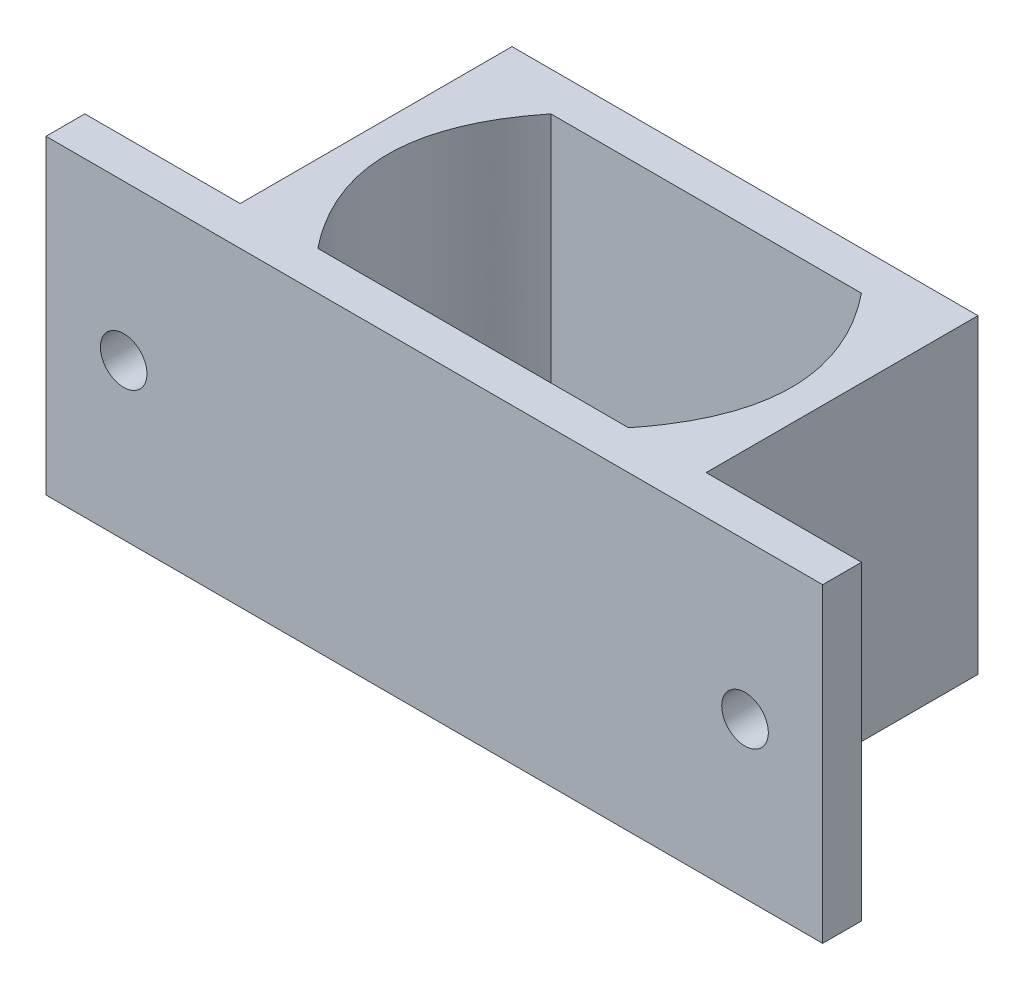
ISO-10303-21;
HEADER;
FILE_DESCRIPTION(('STEP AP214'),'2;1');
FILE_NAME('part.step','',(''),(''),'','','');
FILE_SCHEMA(('AUTOMOTIVE_DESIGN { 1 0 10303 214 1 1 1 1 }'));
ENDSEC;
DATA;
#1=APPLICATION_CONTEXT('core data for automotive mechanical design processes');
#2=APPLICATION_PROTOCOL_DEFINITION('international standard','automotive_design',2000,#1);
#3=PRODUCT_CONTEXT('',#1,'mechanical');
#4=PRODUCT('Part','Part','',(#3));
#5=PRODUCT_RELATED_PRODUCT_CATEGORY('part','',(#4));
#6=PRODUCT_DEFINITION_FORMATION('','',#4);
#7=PRODUCT_DEFINITION_CONTEXT('part definition',#1,'design');
#8=PRODUCT_DEFINITION('design','',#6,#7);
#9=PRODUCT_DEFINITION_SHAPE('','',#8);
#10=(LENGTH_UNIT() NAMED_UNIT(*) SI_UNIT(.MILLI.,.METRE.));
#11=(NAMED_UNIT(*) PLANE_ANGLE_UNIT() SI_UNIT($,.RADIAN.));
#12=(NAMED_UNIT(*) SI_UNIT($,.STERADIAN.) SOLID_ANGLE_UNIT());
#13=UNCERTAINTY_MEASURE_WITH_UNIT(LENGTH_MEASURE(1.E-05),#10,'distance_accuracy_value','');
#14=(GEOMETRIC_REPRESENTATION_CONTEXT(3) GLOBAL_UNCERTAINTY_ASSIGNED_CONTEXT((#13)) GLOBAL_UNIT_ASSIGNED_CONTEXT((#10,
#11,#12)) REPRESENTATION_CONTEXT('',''));
#15=CARTESIAN_POINT('',(0.,0.,0.));
#16=DIRECTION('',(0.,0.,1.));
#17=DIRECTION('',(1.,0.,0.));
#18=AXIS2_PLACEMENT_3D('',#15,#16,#17);
#19=CARTESIAN_POINT('',(-8.13001996852735,20.,-7.5));
#20=CARTESIAN_POINT('',(-14.1300199685275,20.,0.));
#21=CARTESIAN_POINT('',(-8.13001996852735,20.,7.5));
#22=B_SPLINE_CURVE_WITH_KNOTS('',2,(#19,#20,#21),.UNSPECIFIED.,.F.,.F.,(3,3),(0.,1.),.UNSPECIFIED.);
#23=DIRECTION('',(0.,-1.,0.));
#24=VECTOR('',#23,1.);
#25=SURFACE_OF_LINEAR_EXTRUSION('',#22,#24);
#26=CARTESIAN_POINT('',(-8.13001996852735,0.,-7.5));
#27=CARTESIAN_POINT('',(-14.1300199685275,0.,0.));
#28=CARTESIAN_POINT('',(-8.13001996852735,0.,7.5));
#29=B_SPLINE_CURVE_WITH_KNOTS('',2,(#26,#27,#28),.UNSPECIFIED.,.F.,.F.,(3,3),(0.,1.),.UNSPECIFIED.);
#30=CARTESIAN_POINT('',(-8.13001996852745,0.,-7.5));
#31=VERTEX_POINT('',#30);
#32=CARTESIAN_POINT('',(-8.13001996852735,0.,7.5));
#33=VERTEX_POINT('',#32);
#34=EDGE_CURVE('E262',#31,#33,#29,.T.);
#35=ORIENTED_EDGE('',*,*,#34,.F.);
#36=DIRECTION('',(0.,-1.,0.));
#37=VECTOR('',#36,1.);
#38=CARTESIAN_POINT('',(-8.13001996852745,20.,-7.5));
#39=LINE('',#38,#37);
#40=CARTESIAN_POINT('',(-8.13001996852745,20.,-7.5));
#41=VERTEX_POINT('',#40);
#42=EDGE_CURVE('E11',#41,#31,#39,.T.);
#43=ORIENTED_EDGE('',*,*,#42,.F.);
#44=CARTESIAN_POINT('',(-8.13001996852735,20.,7.5));
#45=VERTEX_POINT('',#44);
#46=EDGE_CURVE('E214',#41,#45,#22,.T.);
#47=ORIENTED_EDGE('',*,*,#46,.T.);
#48=DIRECTION('',(0.,-1.,0.));
#49=VECTOR('',#48,1.);
#50=CARTESIAN_POINT('',(-8.13001996852735,20.,7.5));
#51=LINE('',#50,#49);
#52=EDGE_CURVE('E287',#45,#33,#51,.T.);
#53=ORIENTED_EDGE('',*,*,#52,.T.);
#54=EDGE_LOOP('',(#35,#43,#47,#53));
#55=FACE_BOUND('',#54,.T.);
#56=ADVANCED_FACE('F41',(#55),#25,.T.);
#57=CARTESIAN_POINT('',(0.,20.,-7.5));
#58=DIRECTION('',(0.,0.,-1.));
#59=DIRECTION('',(-1.,0.,0.));
#60=AXIS2_PLACEMENT_3D('',#57,#58,#59);
#61=PLANE('',#60);
#62=DIRECTION('',(1.,0.,0.));
#63=VECTOR('',#62,1.);
#64=CARTESIAN_POINT('',(0.,0.,-7.5));
#65=LINE('',#64,#63);
#66=CARTESIAN_POINT('',(11.8699800314725,0.,-7.5));
#67=VERTEX_POINT('',#66);
#68=EDGE_CURVE('E268',#31,#67,#65,.T.);
#69=ORIENTED_EDGE('',*,*,#68,.T.);
#70=DIRECTION('',(0.,-1.,0.));
#71=VECTOR('',#70,1.);
#72=CARTESIAN_POINT('',(11.8699800314725,20.,-7.5));
#73=LINE('',#72,#71);
#74=CARTESIAN_POINT('',(11.8699800314725,20.,-7.5));
#75=VERTEX_POINT('',#74);
#76=EDGE_CURVE('E51',#75,#67,#73,.T.);
#77=ORIENTED_EDGE('',*,*,#76,.F.);
#78=DIRECTION('',(1.,0.,0.));
#79=VECTOR('',#78,1.);
#80=CARTESIAN_POINT('',(0.,20.,-7.5));
#81=LINE('',#80,#79);
#82=EDGE_CURVE('E221',#41,#75,#81,.T.);
#83=ORIENTED_EDGE('',*,*,#82,.F.);
#84=ORIENTED_EDGE('',*,*,#42,.T.);
#85=EDGE_LOOP('',(#69,#77,#83,#84));
#86=FACE_BOUND('',#85,.T.);
#87=ADVANCED_FACE('F230',(#86),#61,.F.);
#88=CARTESIAN_POINT('',(11.8699800314725,20.,-7.5));
#89=CARTESIAN_POINT('',(17.8699800314726,20.,0.));
#90=CARTESIAN_POINT('',(11.8699800314725,20.,7.49999999999999));
#91=B_SPLINE_CURVE_WITH_KNOTS('',2,(#88,#89,#90),.UNSPECIFIED.,.F.,.F.,(3,3),(0.,1.),.UNSPECIFIED.);
#92=DIRECTION('',(0.,-1.,0.));
#93=VECTOR('',#92,1.);
#94=SURFACE_OF_LINEAR_EXTRUSION('',#91,#93);
#95=CARTESIAN_POINT('',(11.8699800314725,0.,-7.5));
#96=CARTESIAN_POINT('',(17.8699800314726,0.,0.));
#97=CARTESIAN_POINT('',(11.8699800314725,0.,7.49999999999999));
#98=B_SPLINE_CURVE_WITH_KNOTS('',2,(#95,#96,#97),.UNSPECIFIED.,.F.,.F.,(3,3),(0.,1.),.UNSPECIFIED.);
#99=CARTESIAN_POINT('',(11.8699800314727,0.,7.5));
#100=VERTEX_POINT('',#99);
#101=EDGE_CURVE('E275',#67,#100,#98,.T.);
#102=ORIENTED_EDGE('',*,*,#101,.T.);
#103=DIRECTION('',(0.,-1.,0.));
#104=VECTOR('',#103,1.);
#105=CARTESIAN_POINT('',(11.8699800314727,20.,7.5));
#106=LINE('',#105,#104);
#107=CARTESIAN_POINT('',(11.8699800314727,20.,7.5));
#108=VERTEX_POINT('',#107);
#109=EDGE_CURVE('E290',#108,#100,#106,.T.);
#110=ORIENTED_EDGE('',*,*,#109,.F.);
#111=EDGE_CURVE('E301',#75,#108,#91,.T.);
#112=ORIENTED_EDGE('',*,*,#111,.F.);
#113=ORIENTED_EDGE('',*,*,#76,.T.);
#114=EDGE_LOOP('',(#102,#110,#112,#113));
#115=FACE_BOUND('',#114,.T.);
#116=ADVANCED_FACE('F246',(#115),#94,.F.);
#117=CARTESIAN_POINT('',(0.,20.,-10.));
#118=DIRECTION('',(0.,0.,-1.));
#119=DIRECTION('',(-1.,0.,0.));
#120=AXIS2_PLACEMENT_3D('',#117,#118,#119);
#121=PLANE('',#120);
#122=DIRECTION('',(1.,0.,0.));
#123=VECTOR('',#122,1.);
#124=CARTESIAN_POINT('',(0.,0.,-10.));
#125=LINE('',#124,#123);
#126=CARTESIAN_POINT('',(-13.1300199685275,0.,-10.));
#127=VERTEX_POINT('',#126);
#128=CARTESIAN_POINT('',(16.8699800314727,0.,-10.));
#129=VERTEX_POINT('',#128);
#130=EDGE_CURVE('E194',#127,#129,#125,.T.);
#131=ORIENTED_EDGE('',*,*,#130,.F.);
#132=DIRECTION('',(0.,-1.,0.));
#133=VECTOR('',#132,1.);
#134=CARTESIAN_POINT('',(-13.1300199685275,20.,-10.));
#135=LINE('',#134,#133);
#136=CARTESIAN_POINT('',(-13.1300199685275,20.,-10.));
#137=VERTEX_POINT('',#136);
#138=EDGE_CURVE('E45',#137,#127,#135,.T.);
#139=ORIENTED_EDGE('',*,*,#138,.F.);
#140=DIRECTION('',(1.,0.,0.));
#141=VECTOR('',#140,1.);
#142=CARTESIAN_POINT('',(0.,20.,-10.));
#143=LINE('',#142,#141);
#144=CARTESIAN_POINT('',(16.8699800314727,20.,-10.));
#145=VERTEX_POINT('',#144);
#146=EDGE_CURVE('E199',#137,#145,#143,.T.);
#147=ORIENTED_EDGE('',*,*,#146,.T.);
#148=DIRECTION('',(0.,-1.,0.));
#149=VECTOR('',#148,1.);
#150=CARTESIAN_POINT('',(16.8699800314727,20.,-10.));
#151=LINE('',#150,#149);
#152=EDGE_CURVE('E295',#145,#129,#151,.T.);
#153=ORIENTED_EDGE('',*,*,#152,.T.);
#154=EDGE_LOOP('',(#131,#139,#147,#153));
#155=FACE_BOUND('',#154,.T.);
#156=ADVANCED_FACE('F43',(#155),#121,.T.);
#157=CARTESIAN_POINT('',(-13.1300199685275,20.,0.));
#158=DIRECTION('',(1.,0.,0.));
#159=DIRECTION('',(0.,0.,-1.));
#160=AXIS2_PLACEMENT_3D('',#157,#158,#159);
#161=PLANE('',#160);
#162=DIRECTION('',(0.,0.,1.));
#163=VECTOR('',#162,1.);
#164=CARTESIAN_POINT('',(-13.1300199685275,0.,0.));
#165=LINE('',#164,#163);
#166=CARTESIAN_POINT('',(-13.1300199685275,0.,7.5));
#167=VERTEX_POINT('',#166);
#168=EDGE_CURVE('E248',#127,#167,#165,.T.);
#169=ORIENTED_EDGE('',*,*,#168,.T.);
#170=DIRECTION('',(0.,1.,0.));
#171=VECTOR('',#170,1.);
#172=CARTESIAN_POINT('',(-13.1300199685275,0.,7.5));
#173=LINE('',#172,#171);
#174=CARTESIAN_POINT('',(-13.1300199685275,20.,7.5));
#175=VERTEX_POINT('',#174);
#176=EDGE_CURVE('E157',#167,#175,#173,.T.);
#177=ORIENTED_EDGE('',*,*,#176,.T.);
#178=DIRECTION('',(0.,0.,1.));
#179=VECTOR('',#178,1.);
#180=CARTESIAN_POINT('',(-13.1300199685275,20.,0.));
#181=LINE('',#180,#179);
#182=EDGE_CURVE('E203',#137,#175,#181,.T.);
#183=ORIENTED_EDGE('',*,*,#182,.F.);
#184=ORIENTED_EDGE('',*,*,#138,.T.);
#185=EDGE_LOOP('',(#169,#177,#183,#184));
#186=FACE_BOUND('',#185,.T.);
#187=ADVANCED_FACE('F239',(#186),#161,.F.);
#188=CARTESIAN_POINT('',(0.,20.,10.));
#189=DIRECTION('',(0.,0.,-1.));
#190=DIRECTION('',(-1.,0.,0.));
#191=AXIS2_PLACEMENT_3D('',#188,#189,#190);
#192=PLANE('',#191);
#193=CARTESIAN_POINT('',(-18.1300199685275,9.99999999999999,10.));
#194=DIRECTION('',(0.,0.,-1.));
#195=DIRECTION('',(-1.,0.,0.));
#196=AXIS2_PLACEMENT_3D('',#193,#194,#195);
#197=CIRCLE('',#196,1.5);
#198=CARTESIAN_POINT('',(-19.6300199685275,9.99999999999999,10.));
#199=VERTEX_POINT('',#198);
#200=EDGE_CURVE('E350',#199,#199,#197,.T.);
#201=ORIENTED_EDGE('',*,*,#200,.T.);
#202=EDGE_LOOP('',(#201));
#203=FACE_BOUND('',#202,.T.);
#204=CARTESIAN_POINT('',(21.8699800314727,9.99999999999998,10.));
#205=DIRECTION('',(0.,0.,-1.));
#206=DIRECTION('',(-1.,0.,0.));
#207=AXIS2_PLACEMENT_3D('',#204,#205,#206);
#208=CIRCLE('',#207,1.5);
#209=CARTESIAN_POINT('',(20.3699800314727,9.99999999999998,10.));
#210=VERTEX_POINT('',#209);
#211=EDGE_CURVE('E164',#210,#210,#208,.T.);
#212=ORIENTED_EDGE('',*,*,#211,.T.);
#213=EDGE_LOOP('',(#212));
#214=FACE_BOUND('',#213,.T.);
#215=DIRECTION('',(1.,0.,0.));
#216=VECTOR('',#215,1.);
#217=CARTESIAN_POINT('',(0.,0.,10.));
#218=LINE('',#217,#216);
#219=CARTESIAN_POINT('',(-23.1300199685275,0.,10.));
#220=VERTEX_POINT('',#219);
#221=CARTESIAN_POINT('',(26.8699800314727,0.,10.));
#222=VERTEX_POINT('',#221);
#223=EDGE_CURVE('E143',#220,#222,#218,.T.);
#224=ORIENTED_EDGE('',*,*,#223,.T.);
#225=DIRECTION('',(0.,1.,0.));
#226=VECTOR('',#225,1.);
#227=CARTESIAN_POINT('',(26.8699800314727,0.,10.));
#228=LINE('',#227,#226);
#229=CARTESIAN_POINT('',(26.8699800314727,20.,10.));
#230=VERTEX_POINT('',#229);
#231=EDGE_CURVE('E190',#222,#230,#228,.T.);
#232=ORIENTED_EDGE('',*,*,#231,.T.);
#233=DIRECTION('',(1.,0.,0.));
#234=VECTOR('',#233,1.);
#235=CARTESIAN_POINT('',(0.,20.,10.));
#236=LINE('',#235,#234);
#237=CARTESIAN_POINT('',(-23.1300199685275,20.,10.));
#238=VERTEX_POINT('',#237);
#239=EDGE_CURVE('E208',#238,#230,#236,.T.);
#240=ORIENTED_EDGE('',*,*,#239,.F.);
#241=DIRECTION('',(0.,1.,0.));
#242=VECTOR('',#241,1.);
#243=CARTESIAN_POINT('',(-23.1300199685275,0.,10.));
#244=LINE('',#243,#242);
#245=EDGE_CURVE('E154',#220,#238,#244,.T.);
#246=ORIENTED_EDGE('',*,*,#245,.F.);
#247=EDGE_LOOP('',(#224,#232,#240,#246));
#248=FACE_BOUND('',#247,.T.);
#249=ADVANCED_FACE('F237',(#203,#214,#248),#192,.F.);
#250=CARTESIAN_POINT('',(16.8699800314727,20.,0.));
#251=DIRECTION('',(1.,0.,0.));
#252=DIRECTION('',(0.,0.,-1.));
#253=AXIS2_PLACEMENT_3D('',#250,#251,#252);
#254=PLANE('',#253);
#255=DIRECTION('',(0.,1.,0.));
#256=VECTOR('',#255,1.);
#257=CARTESIAN_POINT('',(16.8699800314727,0.,7.5));
#258=LINE('',#257,#256);
#259=CARTESIAN_POINT('',(16.8699800314727,0.,7.5));
#260=VERTEX_POINT('',#259);
#261=CARTESIAN_POINT('',(16.8699800314727,20.,7.5));
#262=VERTEX_POINT('',#261);
#263=EDGE_CURVE('E67',#260,#262,#258,.T.);
#264=ORIENTED_EDGE('',*,*,#263,.F.);
#265=DIRECTION('',(0.,0.,1.));
#266=VECTOR('',#265,1.);
#267=CARTESIAN_POINT('',(16.8699800314727,0.,0.));
#268=LINE('',#267,#266);
#269=EDGE_CURVE('E255',#129,#260,#268,.T.);
#270=ORIENTED_EDGE('',*,*,#269,.F.);
#271=ORIENTED_EDGE('',*,*,#152,.F.);
#272=DIRECTION('',(0.,0.,1.));
#273=VECTOR('',#272,1.);
#274=CARTESIAN_POINT('',(16.8699800314727,20.,0.));
#275=LINE('',#274,#273);
#276=EDGE_CURVE('E211',#145,#262,#275,.T.);
#277=ORIENTED_EDGE('',*,*,#276,.T.);
#278=EDGE_LOOP('',(#264,#270,#271,#277));
#279=FACE_BOUND('',#278,.T.);
#280=ADVANCED_FACE('F233',(#279),#254,.T.);
#281=CARTESIAN_POINT('',(0.,20.,7.5));
#282=DIRECTION('',(0.,0.,-1.));
#283=DIRECTION('',(-1.,0.,0.));
#284=AXIS2_PLACEMENT_3D('',#281,#282,#283);
#285=PLANE('',#284);
#286=DIRECTION('',(1.,0.,0.));
#287=VECTOR('',#286,1.);
#288=CARTESIAN_POINT('',(0.,0.,7.5));
#289=LINE('',#288,#287);
#290=EDGE_CURVE('E204',#33,#100,#289,.T.);
#291=ORIENTED_EDGE('',*,*,#290,.F.);
#292=ORIENTED_EDGE('',*,*,#52,.F.);
#293=DIRECTION('',(1.,0.,0.));
#294=VECTOR('',#293,1.);
#295=CARTESIAN_POINT('',(0.,20.,7.5));
#296=LINE('',#295,#294);
#297=EDGE_CURVE('E297',#45,#108,#296,.T.);
#298=ORIENTED_EDGE('',*,*,#297,.T.);
#299=ORIENTED_EDGE('',*,*,#109,.T.);
#300=EDGE_LOOP('',(#291,#292,#298,#299));
#301=FACE_BOUND('',#300,.T.);
#302=ADVANCED_FACE('F236',(#301),#285,.T.);
#303=CARTESIAN_POINT('',(0.,20.,0.));
#304=DIRECTION('',(0.,1.,0.));
#305=DIRECTION('',(0.,0.,1.));
#306=AXIS2_PLACEMENT_3D('',#303,#304,#305);
#307=PLANE('',#306);
#308=ORIENTED_EDGE('',*,*,#146,.F.);
#309=ORIENTED_EDGE('',*,*,#182,.T.);
#310=DIRECTION('',(1.,0.,0.));
#311=VECTOR('',#310,1.);
#312=CARTESIAN_POINT('',(0.,20.,7.5));
#313=LINE('',#312,#311);
#314=CARTESIAN_POINT('',(-23.1300199685275,20.,7.5));
#315=VERTEX_POINT('',#314);
#316=EDGE_CURVE('E59',#315,#175,#313,.T.);
#317=ORIENTED_EDGE('',*,*,#316,.F.);
#318=DIRECTION('',(0.,0.,-1.));
#319=VECTOR('',#318,1.);
#320=CARTESIAN_POINT('',(-23.1300199685275,20.,0.));
#321=LINE('',#320,#319);
#322=EDGE_CURVE('E152',#238,#315,#321,.T.);
#323=ORIENTED_EDGE('',*,*,#322,.F.);
#324=ORIENTED_EDGE('',*,*,#239,.T.);
#325=DIRECTION('',(0.,0.,-1.));
#326=VECTOR('',#325,1.);
#327=CARTESIAN_POINT('',(26.8699800314727,20.,0.));
#328=LINE('',#327,#326);
#329=CARTESIAN_POINT('',(26.8699800314727,20.,7.5));
#330=VERTEX_POINT('',#329);
#331=EDGE_CURVE('E171',#230,#330,#328,.T.);
#332=ORIENTED_EDGE('',*,*,#331,.T.);
#333=DIRECTION('',(-1.,0.,0.));
#334=VECTOR('',#333,1.);
#335=CARTESIAN_POINT('',(0.,20.,7.5));
#336=LINE('',#335,#334);
#337=EDGE_CURVE('E179',#330,#262,#336,.T.);
#338=ORIENTED_EDGE('',*,*,#337,.T.);
#339=ORIENTED_EDGE('',*,*,#276,.F.);
#340=EDGE_LOOP('',(#308,#309,#317,#323,#324,#332,#338,#339));
#341=FACE_BOUND('',#340,.T.);
#342=ORIENTED_EDGE('',*,*,#46,.F.);
#343=ORIENTED_EDGE('',*,*,#82,.T.);
#344=ORIENTED_EDGE('',*,*,#111,.T.);
#345=ORIENTED_EDGE('',*,*,#297,.F.);
#346=EDGE_LOOP('',(#342,#343,#344,#345));
#347=FACE_BOUND('',#346,.T.);
#348=ADVANCED_FACE('F316',(#341,#347),#307,.T.);
#349=CARTESIAN_POINT('',(0.,0.,0.));
#350=DIRECTION('',(0.,1.,0.));
#351=DIRECTION('',(0.,0.,1.));
#352=AXIS2_PLACEMENT_3D('',#349,#350,#351);
#353=PLANE('',#352);
#354=ORIENTED_EDGE('',*,*,#130,.T.);
#355=ORIENTED_EDGE('',*,*,#269,.T.);
#356=DIRECTION('',(-1.,0.,0.));
#357=VECTOR('',#356,1.);
#358=CARTESIAN_POINT('',(0.,0.,7.5));
#359=LINE('',#358,#357);
#360=CARTESIAN_POINT('',(26.8699800314727,0.,7.5));
#361=VERTEX_POINT('',#360);
#362=EDGE_CURVE('E178',#361,#260,#359,.T.);
#363=ORIENTED_EDGE('',*,*,#362,.F.);
#364=DIRECTION('',(0.,0.,-1.));
#365=VECTOR('',#364,1.);
#366=CARTESIAN_POINT('',(26.8699800314727,0.,0.));
#367=LINE('',#366,#365);
#368=EDGE_CURVE('E174',#222,#361,#367,.T.);
#369=ORIENTED_EDGE('',*,*,#368,.F.);
#370=ORIENTED_EDGE('',*,*,#223,.F.);
#371=DIRECTION('',(0.,0.,-1.));
#372=VECTOR('',#371,1.);
#373=CARTESIAN_POINT('',(-23.1300199685275,0.,0.));
#374=LINE('',#373,#372);
#375=CARTESIAN_POINT('',(-23.1300199685275,0.,7.5));
#376=VERTEX_POINT('',#375);
#377=EDGE_CURVE('E134',#220,#376,#374,.T.);
#378=ORIENTED_EDGE('',*,*,#377,.T.);
#379=DIRECTION('',(1.,0.,0.));
#380=VECTOR('',#379,1.);
#381=CARTESIAN_POINT('',(0.,0.,7.5));
#382=LINE('',#381,#380);
#383=EDGE_CURVE('E141',#376,#167,#382,.T.);
#384=ORIENTED_EDGE('',*,*,#383,.T.);
#385=ORIENTED_EDGE('',*,*,#168,.F.);
#386=EDGE_LOOP('',(#354,#355,#363,#369,#370,#378,#384,#385));
#387=FACE_BOUND('',#386,.T.);
#388=ORIENTED_EDGE('',*,*,#34,.T.);
#389=ORIENTED_EDGE('',*,*,#290,.T.);
#390=ORIENTED_EDGE('',*,*,#101,.F.);
#391=ORIENTED_EDGE('',*,*,#68,.F.);
#392=EDGE_LOOP('',(#388,#389,#390,#391));
#393=FACE_BOUND('',#392,.T.);
#394=ADVANCED_FACE('F137',(#387,#393),#353,.F.);
#395=CARTESIAN_POINT('',(26.8699800314727,0.,0.));
#396=DIRECTION('',(1.,0.,0.));
#397=DIRECTION('',(0.,0.,-1.));
#398=AXIS2_PLACEMENT_3D('',#395,#396,#397);
#399=PLANE('',#398);
#400=ORIENTED_EDGE('',*,*,#331,.F.);
#401=ORIENTED_EDGE('',*,*,#231,.F.);
#402=ORIENTED_EDGE('',*,*,#368,.T.);
#403=DIRECTION('',(0.,1.,0.));
#404=VECTOR('',#403,1.);
#405=CARTESIAN_POINT('',(26.8699800314727,0.,7.5));
#406=LINE('',#405,#404);
#407=EDGE_CURVE('E183',#361,#330,#406,.T.);
#408=ORIENTED_EDGE('',*,*,#407,.T.);
#409=EDGE_LOOP('',(#400,#401,#402,#408));
#410=FACE_BOUND('',#409,.T.);
#411=ADVANCED_FACE('F319',(#410),#399,.T.);
#412=CARTESIAN_POINT('',(0.,0.,7.5));
#413=DIRECTION('',(0.,0.,-1.));
#414=DIRECTION('',(-1.,0.,0.));
#415=AXIS2_PLACEMENT_3D('',#412,#413,#414);
#416=PLANE('',#415);
#417=CARTESIAN_POINT('',(21.8699800314727,9.99999999999998,7.50000000000001));
#418=DIRECTION('',(0.,0.,-1.));
#419=DIRECTION('',(-1.,0.,0.));
#420=AXIS2_PLACEMENT_3D('',#417,#418,#419);
#421=CIRCLE('',#420,1.5);
#422=CARTESIAN_POINT('',(20.3699800314727,9.99999999999998,7.50000000000001));
#423=VERTEX_POINT('',#422);
#424=EDGE_CURVE('E355',#423,#423,#421,.T.);
#425=ORIENTED_EDGE('',*,*,#424,.F.);
#426=EDGE_LOOP('',(#425));
#427=FACE_BOUND('',#426,.T.);
#428=ORIENTED_EDGE('',*,*,#337,.F.);
#429=ORIENTED_EDGE('',*,*,#407,.F.);
#430=ORIENTED_EDGE('',*,*,#362,.T.);
#431=ORIENTED_EDGE('',*,*,#263,.T.);
#432=EDGE_LOOP('',(#428,#429,#430,#431));
#433=FACE_BOUND('',#432,.T.);
#434=ADVANCED_FACE('F325',(#427,#433),#416,.T.);
#435=CARTESIAN_POINT('',(0.,0.,7.5));
#436=DIRECTION('',(0.,0.,1.));
#437=DIRECTION('',(1.,0.,0.));
#438=AXIS2_PLACEMENT_3D('',#435,#436,#437);
#439=PLANE('',#438);
#440=CARTESIAN_POINT('',(-18.1300199685274,9.99999999999999,7.5));
#441=DIRECTION('',(0.,0.,-1.));
#442=DIRECTION('',(-1.,0.,0.));
#443=AXIS2_PLACEMENT_3D('',#440,#441,#442);
#444=CIRCLE('',#443,1.5);
#445=CARTESIAN_POINT('',(-19.6300199685275,9.99999999999999,7.5));
#446=VERTEX_POINT('',#445);
#447=EDGE_CURVE('E347',#446,#446,#444,.T.);
#448=ORIENTED_EDGE('',*,*,#447,.F.);
#449=EDGE_LOOP('',(#448));
#450=FACE_BOUND('',#449,.T.);
#451=ORIENTED_EDGE('',*,*,#316,.T.);
#452=ORIENTED_EDGE('',*,*,#176,.F.);
#453=ORIENTED_EDGE('',*,*,#383,.F.);
#454=DIRECTION('',(0.,1.,0.));
#455=VECTOR('',#454,1.);
#456=CARTESIAN_POINT('',(-23.1300199685275,0.,7.5));
#457=LINE('',#456,#455);
#458=EDGE_CURVE('E148',#376,#315,#457,.T.);
#459=ORIENTED_EDGE('',*,*,#458,.T.);
#460=EDGE_LOOP('',(#451,#452,#453,#459));
#461=FACE_BOUND('',#460,.T.);
#462=ADVANCED_FACE('F156',(#450,#461),#439,.F.);
#463=CARTESIAN_POINT('',(-23.1300199685275,0.,0.));
#464=DIRECTION('',(1.,0.,0.));
#465=DIRECTION('',(0.,0.,-1.));
#466=AXIS2_PLACEMENT_3D('',#463,#464,#465);
#467=PLANE('',#466);
#468=ORIENTED_EDGE('',*,*,#322,.T.);
#469=ORIENTED_EDGE('',*,*,#458,.F.);
#470=ORIENTED_EDGE('',*,*,#377,.F.);
#471=ORIENTED_EDGE('',*,*,#245,.T.);
#472=EDGE_LOOP('',(#468,#469,#470,#471));
#473=FACE_BOUND('',#472,.T.);
#474=ADVANCED_FACE('F150',(#473),#467,.F.);
#475=CARTESIAN_POINT('',(-18.1300199685275,9.99999999999999,27.5));
#476=DIRECTION('',(0.,0.,-1.));
#477=DIRECTION('',(-1.,0.,0.));
#478=AXIS2_PLACEMENT_3D('',#475,#476,#477);
#479=CYLINDRICAL_SURFACE('',#478,1.5);
#480=ORIENTED_EDGE('',*,*,#447,.T.);
#481=EDGE_LOOP('',(#480));
#482=FACE_BOUND('',#481,.T.);
#483=ORIENTED_EDGE('',*,*,#200,.F.);
#484=EDGE_LOOP('',(#483));
#485=FACE_BOUND('',#484,.T.);
#486=ADVANCED_FACE('F335',(#482,#485),#479,.F.);
#487=CARTESIAN_POINT('',(21.8699800314727,9.99999999999998,27.5));
#488=DIRECTION('',(0.,0.,-1.));
#489=DIRECTION('',(-1.,0.,0.));
#490=AXIS2_PLACEMENT_3D('',#487,#488,#489);
#491=CYLINDRICAL_SURFACE('',#490,1.5);
#492=ORIENTED_EDGE('',*,*,#424,.T.);
#493=EDGE_LOOP('',(#492));
#494=FACE_BOUND('',#493,.T.);
#495=ORIENTED_EDGE('',*,*,#211,.F.);
#496=EDGE_LOOP('',(#495));
#497=FACE_BOUND('',#496,.T.);
#498=ADVANCED_FACE('F336',(#494,#497),#491,.F.);
#499=CLOSED_SHELL('',(#56,#87,#116,#156,#187,#249,#280,#302,#348,#394,#411,#434,#462,#474,#486,#498));
#500=MANIFOLD_SOLID_BREP('B2',#499);
#501=ADVANCED_BREP_SHAPE_REPRESENTATION('',(#18,#500),#14);
#502=SHAPE_DEFINITION_REPRESENTATION(#9,#501);
ENDSEC;
END-ISO-10303-21;
